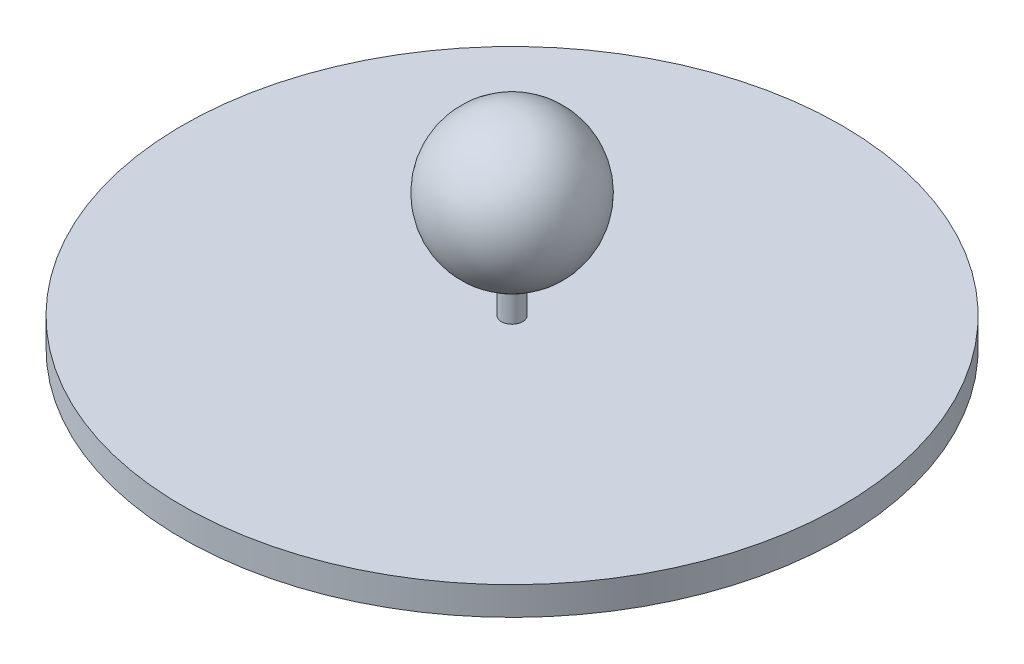
ISO-10303-21;
HEADER;
FILE_DESCRIPTION(('STEP AP214'),'2;1');
FILE_NAME('part.step','',(''),(''),'','','');
FILE_SCHEMA(('AUTOMOTIVE_DESIGN { 1 0 10303 214 1 1 1 1 }'));
ENDSEC;
DATA;
#1=APPLICATION_CONTEXT('core data for automotive mechanical design processes');
#2=APPLICATION_PROTOCOL_DEFINITION('international standard','automotive_design',2000,#1);
#3=PRODUCT_CONTEXT('',#1,'mechanical');
#4=PRODUCT('Part','Part','',(#3));
#5=PRODUCT_RELATED_PRODUCT_CATEGORY('part','',(#4));
#6=PRODUCT_DEFINITION_FORMATION('','',#4);
#7=PRODUCT_DEFINITION_CONTEXT('part definition',#1,'design');
#8=PRODUCT_DEFINITION('design','',#6,#7);
#9=PRODUCT_DEFINITION_SHAPE('','',#8);
#10=(LENGTH_UNIT() NAMED_UNIT(*) SI_UNIT(.MILLI.,.METRE.));
#11=(NAMED_UNIT(*) PLANE_ANGLE_UNIT() SI_UNIT($,.RADIAN.));
#12=(NAMED_UNIT(*) SI_UNIT($,.STERADIAN.) SOLID_ANGLE_UNIT());
#13=UNCERTAINTY_MEASURE_WITH_UNIT(LENGTH_MEASURE(1.E-05),#10,'distance_accuracy_value','');
#14=(GEOMETRIC_REPRESENTATION_CONTEXT(3) GLOBAL_UNCERTAINTY_ASSIGNED_CONTEXT((#13)) GLOBAL_UNIT_ASSIGNED_CONTEXT((#10,
#11,#12)) REPRESENTATION_CONTEXT('',''));
#15=CARTESIAN_POINT('',(0.,0.,0.));
#16=DIRECTION('',(0.,0.,1.));
#17=DIRECTION('',(1.,0.,0.));
#18=AXIS2_PLACEMENT_3D('',#15,#16,#17);
#19=CARTESIAN_POINT('',(0.,290.,0.));
#20=DIRECTION('',(0.,-1.,0.));
#21=DIRECTION('',(0.,0.,-1.));
#22=AXIS2_PLACEMENT_3D('',#19,#20,#21);
#23=CYLINDRICAL_SURFACE('',#22,15.);
#24=CARTESIAN_POINT('',(0.,290.,0.));
#25=DIRECTION('',(0.,-1.,0.));
#26=DIRECTION('',(0.,0.,-1.));
#27=AXIS2_PLACEMENT_3D('',#24,#25,#26);
#28=CIRCLE('',#27,15.);
#29=CARTESIAN_POINT('',(0.,290.,-15.));
#30=VERTEX_POINT('',#29);
#31=EDGE_CURVE('E10',#30,#30,#28,.T.);
#32=ORIENTED_EDGE('',*,*,#31,.T.);
#33=EDGE_LOOP('',(#32));
#34=FACE_BOUND('',#33,.T.);
#35=CARTESIAN_POINT('',(0.,240.,0.));
#36=DIRECTION('',(0.,-1.,0.));
#37=DIRECTION('',(0.,0.,-1.));
#38=AXIS2_PLACEMENT_3D('',#35,#36,#37);
#39=CIRCLE('',#38,15.);
#40=CARTESIAN_POINT('',(0.,240.,-15.));
#41=VERTEX_POINT('',#40);
#42=EDGE_CURVE('E63',#41,#41,#39,.T.);
#43=ORIENTED_EDGE('',*,*,#42,.F.);
#44=EDGE_LOOP('',(#43));
#45=FACE_BOUND('',#44,.T.);
#46=ADVANCED_FACE('F35',(#34,#45),#23,.T.);
#47=CARTESIAN_POINT('',(0.,390.,0.));
#48=DIRECTION('',(0.,-1.,0.));
#49=DIRECTION('',(1.,0.,0.));
#50=AXIS2_PLACEMENT_3D('',#47,#48,#49);
#51=SPHERICAL_SURFACE('',#50,101.118742080783);
#52=ORIENTED_EDGE('',*,*,#31,.F.);
#53=EDGE_LOOP('',(#52));
#54=FACE_BOUND('',#53,.T.);
#55=ADVANCED_FACE('F71',(#54),#51,.T.);
#56=CARTESIAN_POINT('',(0.,0.,0.));
#57=DIRECTION('',(0.,-1.,0.));
#58=DIRECTION('',(0.,0.,-1.));
#59=AXIS2_PLACEMENT_3D('',#56,#57,#58);
#60=PLANE('',#59);
#61=CARTESIAN_POINT('',(0.,0.,0.));
#62=DIRECTION('',(0.,-1.,0.));
#63=DIRECTION('',(0.,0.,-1.));
#64=AXIS2_PLACEMENT_3D('',#61,#62,#63);
#65=CIRCLE('',#64,20.);
#66=CARTESIAN_POINT('',(0.,0.,-20.));
#67=VERTEX_POINT('',#66);
#68=EDGE_CURVE('E41',#67,#67,#65,.T.);
#69=ORIENTED_EDGE('',*,*,#68,.T.);
#70=EDGE_LOOP('',(#69));
#71=FACE_BOUND('',#70,.T.);
#72=ADVANCED_FACE('F75',(#71),#60,.T.);
#73=CARTESIAN_POINT('',(0.,290.,0.));
#74=DIRECTION('',(0.,-1.,0.));
#75=DIRECTION('',(0.,0.,-1.));
#76=AXIS2_PLACEMENT_3D('',#73,#74,#75);
#77=CYLINDRICAL_SURFACE('',#76,20.);
#78=CARTESIAN_POINT('',(0.,100.,0.));
#79=DIRECTION('',(0.,-1.,0.));
#80=DIRECTION('',(0.,0.,-1.));
#81=AXIS2_PLACEMENT_3D('',#78,#79,#80);
#82=CIRCLE('',#81,20.);
#83=CARTESIAN_POINT('',(0.,100.,-20.));
#84=VERTEX_POINT('',#83);
#85=EDGE_CURVE('E45',#84,#84,#82,.T.);
#86=ORIENTED_EDGE('',*,*,#85,.T.);
#87=EDGE_LOOP('',(#86));
#88=FACE_BOUND('',#87,.T.);
#89=ORIENTED_EDGE('',*,*,#68,.F.);
#90=EDGE_LOOP('',(#89));
#91=FACE_BOUND('',#90,.T.);
#92=ADVANCED_FACE('F80',(#88,#91),#77,.T.);
#93=CARTESIAN_POINT('',(0.,100.,0.));
#94=DIRECTION('',(0.,1.,0.));
#95=DIRECTION('',(0.,0.,1.));
#96=AXIS2_PLACEMENT_3D('',#93,#94,#95);
#97=PLANE('',#96);
#98=CARTESIAN_POINT('',(0.,100.,0.));
#99=DIRECTION('',(0.,-1.,0.));
#100=DIRECTION('',(0.,0.,-1.));
#101=AXIS2_PLACEMENT_3D('',#98,#99,#100);
#102=CIRCLE('',#101,15.);
#103=CARTESIAN_POINT('',(0.,100.,-15.));
#104=VERTEX_POINT('',#103);
#105=EDGE_CURVE('E49',#104,#104,#102,.T.);
#106=ORIENTED_EDGE('',*,*,#105,.T.);
#107=EDGE_LOOP('',(#106));
#108=FACE_BOUND('',#107,.T.);
#109=ORIENTED_EDGE('',*,*,#85,.F.);
#110=EDGE_LOOP('',(#109));
#111=FACE_BOUND('',#110,.T.);
#112=ADVANCED_FACE('F85',(#108,#111),#97,.T.);
#113=CARTESIAN_POINT('',(0.,290.,0.));
#114=DIRECTION('',(0.,-1.,0.));
#115=DIRECTION('',(0.,0.,-1.));
#116=AXIS2_PLACEMENT_3D('',#113,#114,#115);
#117=CYLINDRICAL_SURFACE('',#116,15.);
#118=CARTESIAN_POINT('',(0.,200.,0.));
#119=DIRECTION('',(0.,-1.,0.));
#120=DIRECTION('',(0.,0.,-1.));
#121=AXIS2_PLACEMENT_3D('',#118,#119,#120);
#122=CIRCLE('',#121,15.);
#123=CARTESIAN_POINT('',(0.,200.,-15.));
#124=VERTEX_POINT('',#123);
#125=EDGE_CURVE('E54',#124,#124,#122,.T.);
#126=ORIENTED_EDGE('',*,*,#125,.T.);
#127=EDGE_LOOP('',(#126));
#128=FACE_BOUND('',#127,.T.);
#129=ORIENTED_EDGE('',*,*,#105,.F.);
#130=EDGE_LOOP('',(#129));
#131=FACE_BOUND('',#130,.T.);
#132=ADVANCED_FACE('F89',(#128,#131),#117,.T.);
#133=CARTESIAN_POINT('',(0.,200.,0.));
#134=DIRECTION('',(0.,-1.,0.));
#135=DIRECTION('',(0.,0.,-1.));
#136=AXIS2_PLACEMENT_3D('',#133,#134,#135);
#137=PLANE('',#136);
#138=CARTESIAN_POINT('',(0.,200.,0.));
#139=DIRECTION('',(0.,-1.,0.));
#140=DIRECTION('',(0.,0.,-1.));
#141=AXIS2_PLACEMENT_3D('',#138,#139,#140);
#142=CIRCLE('',#141,465.);
#143=CARTESIAN_POINT('',(0.,200.,-465.));
#144=VERTEX_POINT('',#143);
#145=EDGE_CURVE('E57',#144,#144,#142,.T.);
#146=ORIENTED_EDGE('',*,*,#145,.T.);
#147=EDGE_LOOP('',(#146));
#148=FACE_BOUND('',#147,.T.);
#149=ORIENTED_EDGE('',*,*,#125,.F.);
#150=EDGE_LOOP('',(#149));
#151=FACE_BOUND('',#150,.T.);
#152=ADVANCED_FACE('F93',(#148,#151),#137,.T.);
#153=CARTESIAN_POINT('',(0.,290.,0.));
#154=DIRECTION('',(0.,-1.,0.));
#155=DIRECTION('',(0.,0.,-1.));
#156=AXIS2_PLACEMENT_3D('',#153,#154,#155);
#157=CYLINDRICAL_SURFACE('',#156,465.);
#158=CARTESIAN_POINT('',(0.,240.,0.));
#159=DIRECTION('',(0.,-1.,0.));
#160=DIRECTION('',(0.,0.,-1.));
#161=AXIS2_PLACEMENT_3D('',#158,#159,#160);
#162=CIRCLE('',#161,465.);
#163=CARTESIAN_POINT('',(0.,240.,-465.));
#164=VERTEX_POINT('',#163);
#165=EDGE_CURVE('E60',#164,#164,#162,.T.);
#166=ORIENTED_EDGE('',*,*,#165,.T.);
#167=EDGE_LOOP('',(#166));
#168=FACE_BOUND('',#167,.T.);
#169=ORIENTED_EDGE('',*,*,#145,.F.);
#170=EDGE_LOOP('',(#169));
#171=FACE_BOUND('',#170,.T.);
#172=ADVANCED_FACE('F97',(#168,#171),#157,.T.);
#173=CARTESIAN_POINT('',(0.,240.,0.));
#174=DIRECTION('',(0.,1.,0.));
#175=DIRECTION('',(0.,0.,1.));
#176=AXIS2_PLACEMENT_3D('',#173,#174,#175);
#177=PLANE('',#176);
#178=ORIENTED_EDGE('',*,*,#42,.T.);
#179=EDGE_LOOP('',(#178));
#180=FACE_BOUND('',#179,.T.);
#181=ORIENTED_EDGE('',*,*,#165,.F.);
#182=EDGE_LOOP('',(#181));
#183=FACE_BOUND('',#182,.T.);
#184=ADVANCED_FACE('F67',(#180,#183),#177,.T.);
#185=CLOSED_SHELL('',(#46,#55,#72,#92,#112,#132,#152,#172,#184));
#186=MANIFOLD_SOLID_BREP('B2',#185);
#187=ADVANCED_BREP_SHAPE_REPRESENTATION('',(#18,#186),#14);
#188=SHAPE_DEFINITION_REPRESENTATION(#9,#187);
ENDSEC;
END-ISO-10303-21;
